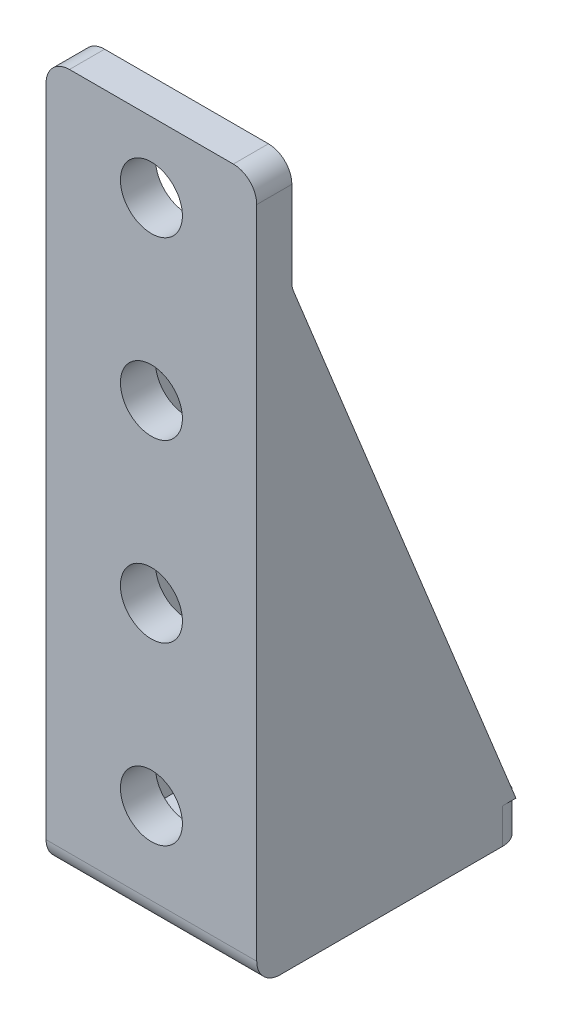
ISO-10303-21;
HEADER;
FILE_DESCRIPTION(('STEP AP214'),'2;1');
FILE_NAME('part.step','',(''),(''),'','','');
FILE_SCHEMA(('AUTOMOTIVE_DESIGN { 1 0 10303 214 1 1 1 1 }'));
ENDSEC;
DATA;
#1=APPLICATION_CONTEXT('core data for automotive mechanical design processes');
#2=APPLICATION_PROTOCOL_DEFINITION('international standard','automotive_design',2000,#1);
#3=PRODUCT_CONTEXT('',#1,'mechanical');
#4=PRODUCT('Part','Part','',(#3));
#5=PRODUCT_RELATED_PRODUCT_CATEGORY('part','',(#4));
#6=PRODUCT_DEFINITION_FORMATION('','',#4);
#7=PRODUCT_DEFINITION_CONTEXT('part definition',#1,'design');
#8=PRODUCT_DEFINITION('design','',#6,#7);
#9=PRODUCT_DEFINITION_SHAPE('','',#8);
#10=(LENGTH_UNIT() NAMED_UNIT(*) SI_UNIT(.MILLI.,.METRE.));
#11=(NAMED_UNIT(*) PLANE_ANGLE_UNIT() SI_UNIT($,.RADIAN.));
#12=(NAMED_UNIT(*) SI_UNIT($,.STERADIAN.) SOLID_ANGLE_UNIT());
#13=UNCERTAINTY_MEASURE_WITH_UNIT(LENGTH_MEASURE(1.E-05),#10,'distance_accuracy_value','');
#14=(GEOMETRIC_REPRESENTATION_CONTEXT(3) GLOBAL_UNCERTAINTY_ASSIGNED_CONTEXT((#13)) GLOBAL_UNIT_ASSIGNED_CONTEXT((#10,
#11,#12)) REPRESENTATION_CONTEXT('',''));
#15=CARTESIAN_POINT('',(0.,0.,0.));
#16=DIRECTION('',(0.,0.,1.));
#17=DIRECTION('',(1.,0.,0.));
#18=AXIS2_PLACEMENT_3D('',#15,#16,#17);
#19=CARTESIAN_POINT('',(0.,0.,0.));
#20=DIRECTION('',(0.,0.,1.));
#21=DIRECTION('',(1.,0.,0.));
#22=AXIS2_PLACEMENT_3D('',#19,#20,#21);
#23=PLANE('',#22);
#24=CARTESIAN_POINT('',(9.,-51.,0.));
#25=DIRECTION('',(0.,0.,1.));
#26=DIRECTION('',(1.,0.,0.));
#27=AXIS2_PLACEMENT_3D('',#24,#25,#26);
#28=CIRCLE('',#27,2.65);
#29=CARTESIAN_POINT('',(11.65,-51.,0.));
#30=VERTEX_POINT('',#29);
#31=EDGE_CURVE('E283',#30,#30,#28,.T.);
#32=ORIENTED_EDGE('',*,*,#31,.T.);
#33=EDGE_LOOP('',(#32));
#34=FACE_BOUND('',#33,.T.);
#35=CARTESIAN_POINT('',(9.,-36.,0.));
#36=DIRECTION('',(0.,0.,1.));
#37=DIRECTION('',(1.,0.,0.));
#38=AXIS2_PLACEMENT_3D('',#35,#36,#37);
#39=CIRCLE('',#38,2.65);
#40=CARTESIAN_POINT('',(11.65,-36.,0.));
#41=VERTEX_POINT('',#40);
#42=EDGE_CURVE('E291',#41,#41,#39,.T.);
#43=ORIENTED_EDGE('',*,*,#42,.T.);
#44=EDGE_LOOP('',(#43));
#45=FACE_BOUND('',#44,.T.);
#46=CARTESIAN_POINT('',(9.,-21.,0.));
#47=DIRECTION('',(0.,0.,1.));
#48=DIRECTION('',(1.,0.,0.));
#49=AXIS2_PLACEMENT_3D('',#46,#47,#48);
#50=CIRCLE('',#49,2.65);
#51=CARTESIAN_POINT('',(11.65,-21.,0.));
#52=VERTEX_POINT('',#51);
#53=EDGE_CURVE('E299',#52,#52,#50,.T.);
#54=ORIENTED_EDGE('',*,*,#53,.T.);
#55=EDGE_LOOP('',(#54));
#56=FACE_BOUND('',#55,.T.);
#57=CARTESIAN_POINT('',(9.,-6.,0.));
#58=DIRECTION('',(0.,0.,1.));
#59=DIRECTION('',(1.,0.,0.));
#60=AXIS2_PLACEMENT_3D('',#57,#58,#59);
#61=CIRCLE('',#60,2.65);
#62=CARTESIAN_POINT('',(11.65,-6.,0.));
#63=VERTEX_POINT('',#62);
#64=EDGE_CURVE('E304',#63,#63,#61,.T.);
#65=ORIENTED_EDGE('',*,*,#64,.T.);
#66=EDGE_LOOP('',(#65));
#67=FACE_BOUND('',#66,.T.);
#68=DIRECTION('',(0.,1.,0.));
#69=VECTOR('',#68,1.);
#70=CARTESIAN_POINT('',(3.,-9.62851294118363,0.));
#71=LINE('',#70,#69);
#72=CARTESIAN_POINT('',(3.00000000000001,-57.,0.));
#73=VERTEX_POINT('',#72);
#74=CARTESIAN_POINT('',(3.,-9.23962422751292,0.));
#75=VERTEX_POINT('',#74);
#76=EDGE_CURVE('E65',#73,#75,#71,.T.);
#77=ORIENTED_EDGE('',*,*,#76,.T.);
#78=DIRECTION('',(-1.,0.,0.));
#79=VECTOR('',#78,1.);
#80=CARTESIAN_POINT('',(0.,-9.23962422751292,0.));
#81=LINE('',#80,#79);
#82=CARTESIAN_POINT('',(0.,-9.23962422751292,0.));
#83=VERTEX_POINT('',#82);
#84=EDGE_CURVE('E395',#75,#83,#81,.T.);
#85=ORIENTED_EDGE('',*,*,#84,.T.);
#86=DIRECTION('',(0.,-1.,0.));
#87=VECTOR('',#86,1.);
#88=CARTESIAN_POINT('',(0.,0.,0.));
#89=LINE('',#88,#87);
#90=CARTESIAN_POINT('',(0.,-2.,0.));
#91=VERTEX_POINT('',#90);
#92=EDGE_CURVE('E309',#91,#83,#89,.T.);
#93=ORIENTED_EDGE('',*,*,#92,.F.);
#94=CARTESIAN_POINT('',(2.,-2.,0.));
#95=DIRECTION('',(0.,0.,1.));
#96=DIRECTION('',(1.,0.,0.));
#97=AXIS2_PLACEMENT_3D('',#94,#95,#96);
#98=CIRCLE('',#97,2.);
#99=CARTESIAN_POINT('',(2.,0.,0.));
#100=VERTEX_POINT('',#99);
#101=EDGE_CURVE('E359',#91,#100,#98,.F.);
#102=ORIENTED_EDGE('',*,*,#101,.T.);
#103=DIRECTION('',(-1.,0.,0.));
#104=VECTOR('',#103,1.);
#105=CARTESIAN_POINT('',(0.,0.,0.));
#106=LINE('',#105,#104);
#107=CARTESIAN_POINT('',(16.,0.,0.));
#108=VERTEX_POINT('',#107);
#109=EDGE_CURVE('E316',#108,#100,#106,.T.);
#110=ORIENTED_EDGE('',*,*,#109,.F.);
#111=CARTESIAN_POINT('',(16.,-2.,0.));
#112=DIRECTION('',(0.,0.,1.));
#113=DIRECTION('',(1.,0.,0.));
#114=AXIS2_PLACEMENT_3D('',#111,#112,#113);
#115=CIRCLE('',#114,2.);
#116=CARTESIAN_POINT('',(18.,-2.,0.));
#117=VERTEX_POINT('',#116);
#118=EDGE_CURVE('E354',#108,#117,#115,.F.);
#119=ORIENTED_EDGE('',*,*,#118,.T.);
#120=DIRECTION('',(0.,1.,0.));
#121=VECTOR('',#120,1.);
#122=CARTESIAN_POINT('',(18.,0.,0.));
#123=LINE('',#122,#121);
#124=CARTESIAN_POINT('',(18.,-9.23962422751292,0.));
#125=VERTEX_POINT('',#124);
#126=EDGE_CURVE('E321',#125,#117,#123,.T.);
#127=ORIENTED_EDGE('',*,*,#126,.F.);
#128=DIRECTION('',(1.,0.,0.));
#129=VECTOR('',#128,1.);
#130=CARTESIAN_POINT('',(0.,-9.23962422751292,0.));
#131=LINE('',#130,#129);
#132=CARTESIAN_POINT('',(15.,-9.23962422751292,0.));
#133=VERTEX_POINT('',#132);
#134=EDGE_CURVE('E388',#125,#133,#131,.F.);
#135=ORIENTED_EDGE('',*,*,#134,.T.);
#136=DIRECTION('',(0.,-1.,0.));
#137=VECTOR('',#136,1.);
#138=CARTESIAN_POINT('',(15.,-57.,0.));
#139=LINE('',#138,#137);
#140=CARTESIAN_POINT('',(15.,-57.,0.));
#141=VERTEX_POINT('',#140);
#142=EDGE_CURVE('E221',#133,#141,#139,.T.);
#143=ORIENTED_EDGE('',*,*,#142,.T.);
#144=DIRECTION('',(-1.,0.,0.));
#145=VECTOR('',#144,1.);
#146=CARTESIAN_POINT('',(0.,-57.,0.));
#147=LINE('',#146,#145);
#148=EDGE_CURVE('E282',#141,#73,#147,.T.);
#149=ORIENTED_EDGE('',*,*,#148,.T.);
#150=EDGE_LOOP('',(#77,#85,#93,#102,#110,#119,#127,#135,#143,#149));
#151=FACE_BOUND('',#150,.T.);
#152=ADVANCED_FACE('F39',(#34,#45,#56,#67,#151),#23,.F.);
#153=CARTESIAN_POINT('',(0.,-57.,0.));
#154=DIRECTION('',(0.,-1.,0.));
#155=DIRECTION('',(0.,0.,-1.));
#156=AXIS2_PLACEMENT_3D('',#153,#154,#155);
#157=PLANE('',#156);
#158=DIRECTION('',(0.,0.,1.));
#159=VECTOR('',#158,1.);
#160=CARTESIAN_POINT('',(10.6,-57.,-6.02510414656997));
#161=LINE('',#160,#159);
#162=CARTESIAN_POINT('',(10.6,-57.,-16.02510414657));
#163=VERTEX_POINT('',#162);
#164=CARTESIAN_POINT('',(10.6,-57.,-6.02510414656997));
#165=VERTEX_POINT('',#164);
#166=EDGE_CURVE('E258',#163,#165,#161,.T.);
#167=ORIENTED_EDGE('',*,*,#166,.T.);
#168=CARTESIAN_POINT('',(8.99999999999999,-57.,-6.02510414656997));
#169=DIRECTION('',(0.,-1.,0.));
#170=DIRECTION('',(0.,0.,-1.));
#171=AXIS2_PLACEMENT_3D('',#168,#169,#170);
#172=CIRCLE('',#171,1.6);
#173=CARTESIAN_POINT('',(7.39999999999999,-57.,-6.02510414656997));
#174=VERTEX_POINT('',#173);
#175=EDGE_CURVE('E247',#165,#174,#172,.T.);
#176=ORIENTED_EDGE('',*,*,#175,.T.);
#177=DIRECTION('',(0.,0.,-1.));
#178=VECTOR('',#177,1.);
#179=CARTESIAN_POINT('',(7.39999999999999,-57.,-6.02510414656997));
#180=LINE('',#179,#178);
#181=CARTESIAN_POINT('',(7.39999999999999,-57.,-16.02510414657));
#182=VERTEX_POINT('',#181);
#183=EDGE_CURVE('E246',#174,#182,#180,.T.);
#184=ORIENTED_EDGE('',*,*,#183,.T.);
#185=CARTESIAN_POINT('',(8.99999999999998,-57.,-16.02510414657));
#186=DIRECTION('',(0.,-1.,0.));
#187=DIRECTION('',(0.,0.,-1.));
#188=AXIS2_PLACEMENT_3D('',#185,#186,#187);
#189=CIRCLE('',#188,1.6);
#190=EDGE_CURVE('E254',#182,#163,#189,.T.);
#191=ORIENTED_EDGE('',*,*,#190,.T.);
#192=EDGE_LOOP('',(#167,#176,#184,#191));
#193=FACE_BOUND('',#192,.T.);
#194=DIRECTION('',(0.,0.,-1.));
#195=VECTOR('',#194,1.);
#196=CARTESIAN_POINT('',(15.,-57.,-19.146125));
#197=LINE('',#196,#195);
#198=CARTESIAN_POINT('',(15.,-57.,-20.));
#199=VERTEX_POINT('',#198);
#200=EDGE_CURVE('E230',#141,#199,#197,.T.);
#201=ORIENTED_EDGE('',*,*,#200,.T.);
#202=DIRECTION('',(1.,0.,0.));
#203=VECTOR('',#202,1.);
#204=CARTESIAN_POINT('',(0.,-57.,-20.));
#205=LINE('',#204,#203);
#206=CARTESIAN_POINT('',(3.,-57.,-20.));
#207=VERTEX_POINT('',#206);
#208=EDGE_CURVE('E285',#207,#199,#205,.T.);
#209=ORIENTED_EDGE('',*,*,#208,.F.);
#210=DIRECTION('',(0.,0.,1.));
#211=VECTOR('',#210,1.);
#212=CARTESIAN_POINT('',(3.00000000000001,-57.,0.));
#213=LINE('',#212,#211);
#214=EDGE_CURVE('E236',#207,#73,#213,.T.);
#215=ORIENTED_EDGE('',*,*,#214,.T.);
#216=ORIENTED_EDGE('',*,*,#148,.F.);
#217=EDGE_LOOP('',(#201,#209,#215,#216));
#218=FACE_BOUND('',#217,.T.);
#219=ADVANCED_FACE('F443',(#193,#218),#157,.F.);
#220=CARTESIAN_POINT('',(0.,0.,3.));
#221=DIRECTION('',(0.,0.,1.));
#222=DIRECTION('',(1.,0.,0.));
#223=AXIS2_PLACEMENT_3D('',#220,#221,#222);
#224=PLANE('',#223);
#225=CARTESIAN_POINT('',(9.,-36.,3.));
#226=DIRECTION('',(0.,0.,1.));
#227=DIRECTION('',(1.,0.,0.));
#228=AXIS2_PLACEMENT_3D('',#225,#226,#227);
#229=CIRCLE('',#228,2.65);
#230=CARTESIAN_POINT('',(11.65,-36.,3.));
#231=VERTEX_POINT('',#230);
#232=EDGE_CURVE('E293',#231,#231,#229,.T.);
#233=ORIENTED_EDGE('',*,*,#232,.F.);
#234=EDGE_LOOP('',(#233));
#235=FACE_BOUND('',#234,.T.);
#236=CARTESIAN_POINT('',(9.,-6.,3.));
#237=DIRECTION('',(0.,0.,1.));
#238=DIRECTION('',(1.,0.,0.));
#239=AXIS2_PLACEMENT_3D('',#236,#237,#238);
#240=CIRCLE('',#239,2.65);
#241=CARTESIAN_POINT('',(11.65,-6.,3.));
#242=VERTEX_POINT('',#241);
#243=EDGE_CURVE('E307',#242,#242,#240,.T.);
#244=ORIENTED_EDGE('',*,*,#243,.F.);
#245=EDGE_LOOP('',(#244));
#246=FACE_BOUND('',#245,.T.);
#247=DIRECTION('',(0.,-1.,0.));
#248=VECTOR('',#247,1.);
#249=CARTESIAN_POINT('',(0.,0.,3.));
#250=LINE('',#249,#248);
#251=CARTESIAN_POINT('',(0.,-2.,3.));
#252=VERTEX_POINT('',#251);
#253=CARTESIAN_POINT('',(0.,-58.,3.));
#254=VERTEX_POINT('',#253);
#255=EDGE_CURVE('E315',#252,#254,#250,.T.);
#256=ORIENTED_EDGE('',*,*,#255,.T.);
#257=DIRECTION('',(1.,0.,0.));
#258=VECTOR('',#257,1.);
#259=CARTESIAN_POINT('',(18.,-58.,3.));
#260=LINE('',#259,#258);
#261=CARTESIAN_POINT('',(18.,-58.,3.));
#262=VERTEX_POINT('',#261);
#263=EDGE_CURVE('E368',#254,#262,#260,.T.);
#264=ORIENTED_EDGE('',*,*,#263,.T.);
#265=DIRECTION('',(0.,1.,0.));
#266=VECTOR('',#265,1.);
#267=CARTESIAN_POINT('',(18.,0.,3.));
#268=LINE('',#267,#266);
#269=CARTESIAN_POINT('',(18.,-2.,3.));
#270=VERTEX_POINT('',#269);
#271=EDGE_CURVE('E314',#262,#270,#268,.T.);
#272=ORIENTED_EDGE('',*,*,#271,.T.);
#273=CARTESIAN_POINT('',(16.,-2.,3.));
#274=DIRECTION('',(0.,0.,1.));
#275=DIRECTION('',(1.,0.,0.));
#276=AXIS2_PLACEMENT_3D('',#273,#274,#275);
#277=CIRCLE('',#276,2.);
#278=CARTESIAN_POINT('',(16.,0.,3.));
#279=VERTEX_POINT('',#278);
#280=EDGE_CURVE('E364',#270,#279,#277,.T.);
#281=ORIENTED_EDGE('',*,*,#280,.T.);
#282=DIRECTION('',(-1.,0.,0.));
#283=VECTOR('',#282,1.);
#284=CARTESIAN_POINT('',(0.,0.,3.));
#285=LINE('',#284,#283);
#286=CARTESIAN_POINT('',(2.,0.,3.));
#287=VERTEX_POINT('',#286);
#288=EDGE_CURVE('E317',#279,#287,#285,.T.);
#289=ORIENTED_EDGE('',*,*,#288,.T.);
#290=CARTESIAN_POINT('',(2.,-2.,3.));
#291=DIRECTION('',(0.,0.,1.));
#292=DIRECTION('',(1.,0.,0.));
#293=AXIS2_PLACEMENT_3D('',#290,#291,#292);
#294=CIRCLE('',#293,2.);
#295=EDGE_CURVE('E370',#287,#252,#294,.T.);
#296=ORIENTED_EDGE('',*,*,#295,.T.);
#297=EDGE_LOOP('',(#256,#264,#272,#281,#289,#296));
#298=FACE_BOUND('',#297,.T.);
#299=CARTESIAN_POINT('',(9.,-21.,3.));
#300=DIRECTION('',(0.,0.,1.));
#301=DIRECTION('',(1.,0.,0.));
#302=AXIS2_PLACEMENT_3D('',#299,#300,#301);
#303=CIRCLE('',#302,2.65);
#304=CARTESIAN_POINT('',(11.65,-21.,3.));
#305=VERTEX_POINT('',#304);
#306=EDGE_CURVE('E298',#305,#305,#303,.T.);
#307=ORIENTED_EDGE('',*,*,#306,.F.);
#308=EDGE_LOOP('',(#307));
#309=FACE_BOUND('',#308,.T.);
#310=CARTESIAN_POINT('',(9.,-51.,3.));
#311=DIRECTION('',(0.,0.,1.));
#312=DIRECTION('',(1.,0.,0.));
#313=AXIS2_PLACEMENT_3D('',#310,#311,#312);
#314=CIRCLE('',#313,2.65);
#315=CARTESIAN_POINT('',(11.65,-51.,3.));
#316=VERTEX_POINT('',#315);
#317=EDGE_CURVE('E287',#316,#316,#314,.T.);
#318=ORIENTED_EDGE('',*,*,#317,.F.);
#319=EDGE_LOOP('',(#318));
#320=FACE_BOUND('',#319,.T.);
#321=ADVANCED_FACE('F452',(#235,#246,#298,#309,#320),#224,.T.);
#322=CARTESIAN_POINT('',(0.,0.,3.));
#323=DIRECTION('',(1.,0.,0.));
#324=DIRECTION('',(0.,1.,0.));
#325=AXIS2_PLACEMENT_3D('',#322,#323,#324);
#326=PLANE('',#325);
#327=DIRECTION('',(0.,0.,-1.));
#328=VECTOR('',#327,1.);
#329=CARTESIAN_POINT('',(0.,-60.,3.));
#330=LINE('',#329,#328);
#331=CARTESIAN_POINT('',(0.,-60.,1.));
#332=VERTEX_POINT('',#331);
#333=CARTESIAN_POINT('',(0.,-60.,-18.));
#334=VERTEX_POINT('',#333);
#335=EDGE_CURVE('E326',#332,#334,#330,.T.);
#336=ORIENTED_EDGE('',*,*,#335,.F.);
#337=CARTESIAN_POINT('',(0.,-58.,1.));
#338=DIRECTION('',(1.,0.,0.));
#339=DIRECTION('',(0.,1.,0.));
#340=AXIS2_PLACEMENT_3D('',#337,#338,#339);
#341=CIRCLE('',#340,2.);
#342=EDGE_CURVE('E377',#332,#254,#341,.F.);
#343=ORIENTED_EDGE('',*,*,#342,.T.);
#344=ORIENTED_EDGE('',*,*,#255,.F.);
#345=DIRECTION('',(0.,0.,-1.));
#346=VECTOR('',#345,1.);
#347=CARTESIAN_POINT('',(0.,-2.,3.));
#348=LINE('',#347,#346);
#349=EDGE_CURVE('E347',#252,#91,#348,.T.);
#350=ORIENTED_EDGE('',*,*,#349,.T.);
#351=ORIENTED_EDGE('',*,*,#92,.T.);
#352=CARTESIAN_POINT('',(0.,-9.23962422751292,-2.));
#353=DIRECTION('',(1.,0.,0.));
#354=DIRECTION('',(0.,1.,0.));
#355=AXIS2_PLACEMENT_3D('',#352,#353,#354);
#356=CIRCLE('',#355,2.);
#357=CARTESIAN_POINT('',(0.,-9.98906629362899,-0.145724780531306));
#358=VERTEX_POINT('',#357);
#359=EDGE_CURVE('E563',#83,#358,#356,.T.);
#360=ORIENTED_EDGE('',*,*,#359,.T.);
#361=DIRECTION('',(0.,-0.927137609734347,-0.374721033058036));
#362=VECTOR('',#361,1.);
#363=CARTESIAN_POINT('',(0.,-9.62851294118363,0.));
#364=LINE('',#363,#362);
#365=CARTESIAN_POINT('',(0.,-57.,-19.146125));
#366=VERTEX_POINT('',#365);
#367=EDGE_CURVE('E209',#358,#366,#364,.T.);
#368=ORIENTED_EDGE('',*,*,#367,.T.);
#369=DIRECTION('',(0.,0.,1.));
#370=VECTOR('',#369,1.);
#371=CARTESIAN_POINT('',(0.,-57.,0.));
#372=LINE('',#371,#370);
#373=CARTESIAN_POINT('',(0.,-57.,-18.));
#374=VERTEX_POINT('',#373);
#375=EDGE_CURVE('E231',#366,#374,#372,.T.);
#376=ORIENTED_EDGE('',*,*,#375,.T.);
#377=DIRECTION('',(0.,-1.,0.));
#378=VECTOR('',#377,1.);
#379=CARTESIAN_POINT('',(0.,-60.,-18.));
#380=LINE('',#379,#378);
#381=EDGE_CURVE('E355',#374,#334,#380,.T.);
#382=ORIENTED_EDGE('',*,*,#381,.T.);
#383=EDGE_LOOP('',(#336,#343,#344,#350,#351,#360,#368,#376,#382));
#384=FACE_BOUND('',#383,.T.);
#385=ADVANCED_FACE('F412',(#384),#326,.F.);
#386=CARTESIAN_POINT('',(0.,-60.,3.));
#387=DIRECTION('',(0.,1.,0.));
#388=DIRECTION('',(0.,0.,1.));
#389=AXIS2_PLACEMENT_3D('',#386,#387,#388);
#390=PLANE('',#389);
#391=DIRECTION('',(0.,0.,-1.));
#392=VECTOR('',#391,1.);
#393=CARTESIAN_POINT('',(18.,-60.,3.));
#394=LINE('',#393,#392);
#395=CARTESIAN_POINT('',(18.,-60.,1.));
#396=VERTEX_POINT('',#395);
#397=CARTESIAN_POINT('',(18.,-60.,-18.));
#398=VERTEX_POINT('',#397);
#399=EDGE_CURVE('E322',#396,#398,#394,.T.);
#400=ORIENTED_EDGE('',*,*,#399,.F.);
#401=DIRECTION('',(1.,0.,0.));
#402=VECTOR('',#401,1.);
#403=CARTESIAN_POINT('',(0.,-60.,1.));
#404=LINE('',#403,#402);
#405=EDGE_CURVE('E371',#396,#332,#404,.F.);
#406=ORIENTED_EDGE('',*,*,#405,.T.);
#407=ORIENTED_EDGE('',*,*,#335,.T.);
#408=CARTESIAN_POINT('',(2.00000000000001,-60.,-18.));
#409=DIRECTION('',(0.,1.,0.));
#410=DIRECTION('',(0.,0.,1.));
#411=AXIS2_PLACEMENT_3D('',#408,#409,#410);
#412=CIRCLE('',#411,2.);
#413=CARTESIAN_POINT('',(2.00000000000001,-60.,-20.));
#414=VERTEX_POINT('',#413);
#415=EDGE_CURVE('E340',#334,#414,#412,.F.);
#416=ORIENTED_EDGE('',*,*,#415,.T.);
#417=DIRECTION('',(1.,0.,0.));
#418=VECTOR('',#417,1.);
#419=CARTESIAN_POINT('',(0.,-60.,-20.));
#420=LINE('',#419,#418);
#421=CARTESIAN_POINT('',(16.,-60.,-20.));
#422=VERTEX_POINT('',#421);
#423=EDGE_CURVE('E271',#414,#422,#420,.T.);
#424=ORIENTED_EDGE('',*,*,#423,.T.);
#425=CARTESIAN_POINT('',(16.,-60.,-18.));
#426=DIRECTION('',(0.,1.,0.));
#427=DIRECTION('',(0.,0.,1.));
#428=AXIS2_PLACEMENT_3D('',#425,#426,#427);
#429=CIRCLE('',#428,2.);
#430=EDGE_CURVE('E339',#422,#398,#429,.F.);
#431=ORIENTED_EDGE('',*,*,#430,.T.);
#432=EDGE_LOOP('',(#400,#406,#407,#416,#424,#431));
#433=FACE_BOUND('',#432,.T.);
#434=CARTESIAN_POINT('',(8.99999999999999,-60.,-6.02510414656997));
#435=DIRECTION('',(0.,-1.,0.));
#436=DIRECTION('',(0.,0.,-1.));
#437=AXIS2_PLACEMENT_3D('',#434,#435,#436);
#438=CIRCLE('',#437,1.6);
#439=CARTESIAN_POINT('',(10.6,-60.,-6.02510414656997));
#440=VERTEX_POINT('',#439);
#441=CARTESIAN_POINT('',(7.39999999999999,-60.,-6.02510414656997));
#442=VERTEX_POINT('',#441);
#443=EDGE_CURVE('E244',#440,#442,#438,.T.);
#444=ORIENTED_EDGE('',*,*,#443,.F.);
#445=DIRECTION('',(0.,0.,1.));
#446=VECTOR('',#445,1.);
#447=CARTESIAN_POINT('',(10.6,-60.,-6.02510414656997));
#448=LINE('',#447,#446);
#449=CARTESIAN_POINT('',(10.6,-60.,-16.02510414657));
#450=VERTEX_POINT('',#449);
#451=EDGE_CURVE('E248',#450,#440,#448,.T.);
#452=ORIENTED_EDGE('',*,*,#451,.F.);
#453=CARTESIAN_POINT('',(8.99999999999998,-60.,-16.02510414657));
#454=DIRECTION('',(0.,-1.,0.));
#455=DIRECTION('',(0.,0.,-1.));
#456=AXIS2_PLACEMENT_3D('',#453,#454,#455);
#457=CIRCLE('',#456,1.6);
#458=CARTESIAN_POINT('',(7.39999999999998,-60.,-16.02510414657));
#459=VERTEX_POINT('',#458);
#460=EDGE_CURVE('E264',#459,#450,#457,.T.);
#461=ORIENTED_EDGE('',*,*,#460,.F.);
#462=DIRECTION('',(0.,0.,-1.));
#463=VECTOR('',#462,1.);
#464=CARTESIAN_POINT('',(7.39999999999999,-60.,-6.02510414656997));
#465=LINE('',#464,#463);
#466=EDGE_CURVE('E263',#442,#459,#465,.T.);
#467=ORIENTED_EDGE('',*,*,#466,.F.);
#468=EDGE_LOOP('',(#444,#452,#461,#467));
#469=FACE_BOUND('',#468,.T.);
#470=ADVANCED_FACE('F463',(#433,#469),#390,.F.);
#471=CARTESIAN_POINT('',(18.,0.,3.));
#472=DIRECTION('',(-1.,0.,0.));
#473=DIRECTION('',(0.,-1.,0.));
#474=AXIS2_PLACEMENT_3D('',#471,#472,#473);
#475=PLANE('',#474);
#476=ORIENTED_EDGE('',*,*,#271,.F.);
#477=CARTESIAN_POINT('',(18.,-58.,1.));
#478=DIRECTION('',(-1.,0.,0.));
#479=DIRECTION('',(0.,-1.,0.));
#480=AXIS2_PLACEMENT_3D('',#477,#478,#479);
#481=CIRCLE('',#480,2.);
#482=EDGE_CURVE('E374',#262,#396,#481,.F.);
#483=ORIENTED_EDGE('',*,*,#482,.T.);
#484=ORIENTED_EDGE('',*,*,#399,.T.);
#485=DIRECTION('',(0.,-1.,0.));
#486=VECTOR('',#485,1.);
#487=CARTESIAN_POINT('',(18.,-57.,-18.));
#488=LINE('',#487,#486);
#489=CARTESIAN_POINT('',(18.,-57.,-18.));
#490=VERTEX_POINT('',#489);
#491=EDGE_CURVE('E220',#398,#490,#488,.F.);
#492=ORIENTED_EDGE('',*,*,#491,.T.);
#493=DIRECTION('',(0.,0.,-1.));
#494=VECTOR('',#493,1.);
#495=CARTESIAN_POINT('',(18.,-57.,-19.146125));
#496=LINE('',#495,#494);
#497=CARTESIAN_POINT('',(18.,-57.,-19.146125));
#498=VERTEX_POINT('',#497);
#499=EDGE_CURVE('E202',#490,#498,#496,.T.);
#500=ORIENTED_EDGE('',*,*,#499,.T.);
#501=DIRECTION('',(0.,0.927137609734347,0.374721033058036));
#502=VECTOR('',#501,1.);
#503=CARTESIAN_POINT('',(18.,-9.62851294118363,0.));
#504=LINE('',#503,#502);
#505=CARTESIAN_POINT('',(18.,-9.98906629362899,-0.145724780531306));
#506=VERTEX_POINT('',#505);
#507=EDGE_CURVE('E214',#498,#506,#504,.T.);
#508=ORIENTED_EDGE('',*,*,#507,.T.);
#509=CARTESIAN_POINT('',(18.,-9.23962422751292,-2.));
#510=DIRECTION('',(-1.,0.,0.));
#511=DIRECTION('',(0.,-1.,0.));
#512=AXIS2_PLACEMENT_3D('',#509,#510,#511);
#513=CIRCLE('',#512,2.);
#514=EDGE_CURVE('E50',#506,#125,#513,.T.);
#515=ORIENTED_EDGE('',*,*,#514,.T.);
#516=ORIENTED_EDGE('',*,*,#126,.T.);
#517=DIRECTION('',(0.,0.,-1.));
#518=VECTOR('',#517,1.);
#519=CARTESIAN_POINT('',(18.,-2.,3.));
#520=LINE('',#519,#518);
#521=EDGE_CURVE('E345',#117,#270,#520,.F.);
#522=ORIENTED_EDGE('',*,*,#521,.T.);
#523=EDGE_LOOP('',(#476,#483,#484,#492,#500,#508,#515,#516,#522));
#524=FACE_BOUND('',#523,.T.);
#525=ADVANCED_FACE('F213',(#524),#475,.F.);
#526=CARTESIAN_POINT('',(0.,0.,3.));
#527=DIRECTION('',(0.,-1.,0.));
#528=DIRECTION('',(0.,0.,-1.));
#529=AXIS2_PLACEMENT_3D('',#526,#527,#528);
#530=PLANE('',#529);
#531=ORIENTED_EDGE('',*,*,#109,.T.);
#532=DIRECTION('',(0.,0.,-1.));
#533=VECTOR('',#532,1.);
#534=CARTESIAN_POINT('',(2.,0.,3.));
#535=LINE('',#534,#533);
#536=EDGE_CURVE('E362',#100,#287,#535,.F.);
#537=ORIENTED_EDGE('',*,*,#536,.T.);
#538=ORIENTED_EDGE('',*,*,#288,.F.);
#539=DIRECTION('',(0.,0.,-1.));
#540=VECTOR('',#539,1.);
#541=CARTESIAN_POINT('',(16.,0.,3.));
#542=LINE('',#541,#540);
#543=EDGE_CURVE('E358',#279,#108,#542,.T.);
#544=ORIENTED_EDGE('',*,*,#543,.T.);
#545=EDGE_LOOP('',(#531,#537,#538,#544));
#546=FACE_BOUND('',#545,.T.);
#547=ADVANCED_FACE('F456',(#546),#530,.F.);
#548=CARTESIAN_POINT('',(9.,-6.,3.));
#549=DIRECTION('',(0.,0.,-1.));
#550=DIRECTION('',(-1.,0.,0.));
#551=AXIS2_PLACEMENT_3D('',#548,#549,#550);
#552=CYLINDRICAL_SURFACE('',#551,2.65);
#553=ORIENTED_EDGE('',*,*,#243,.T.);
#554=EDGE_LOOP('',(#553));
#555=FACE_BOUND('',#554,.T.);
#556=ORIENTED_EDGE('',*,*,#64,.F.);
#557=EDGE_LOOP('',(#556));
#558=FACE_BOUND('',#557,.T.);
#559=ADVANCED_FACE('F461',(#555,#558),#552,.F.);
#560=CARTESIAN_POINT('',(9.,-21.,3.));
#561=DIRECTION('',(0.,0.,-1.));
#562=DIRECTION('',(-1.,0.,0.));
#563=AXIS2_PLACEMENT_3D('',#560,#561,#562);
#564=CYLINDRICAL_SURFACE('',#563,2.65);
#565=ORIENTED_EDGE('',*,*,#306,.T.);
#566=EDGE_LOOP('',(#565));
#567=FACE_BOUND('',#566,.T.);
#568=ORIENTED_EDGE('',*,*,#53,.F.);
#569=EDGE_LOOP('',(#568));
#570=FACE_BOUND('',#569,.T.);
#571=ADVANCED_FACE('F512',(#567,#570),#564,.F.);
#572=CARTESIAN_POINT('',(9.,-36.,3.));
#573=DIRECTION('',(0.,0.,-1.));
#574=DIRECTION('',(-1.,0.,0.));
#575=AXIS2_PLACEMENT_3D('',#572,#573,#574);
#576=CYLINDRICAL_SURFACE('',#575,2.65);
#577=ORIENTED_EDGE('',*,*,#232,.T.);
#578=EDGE_LOOP('',(#577));
#579=FACE_BOUND('',#578,.T.);
#580=ORIENTED_EDGE('',*,*,#42,.F.);
#581=EDGE_LOOP('',(#580));
#582=FACE_BOUND('',#581,.T.);
#583=ADVANCED_FACE('F506',(#579,#582),#576,.F.);
#584=CARTESIAN_POINT('',(9.,-51.,3.));
#585=DIRECTION('',(0.,0.,-1.));
#586=DIRECTION('',(-1.,0.,0.));
#587=AXIS2_PLACEMENT_3D('',#584,#585,#586);
#588=CYLINDRICAL_SURFACE('',#587,2.65);
#589=ORIENTED_EDGE('',*,*,#317,.T.);
#590=EDGE_LOOP('',(#589));
#591=FACE_BOUND('',#590,.T.);
#592=ORIENTED_EDGE('',*,*,#31,.F.);
#593=EDGE_LOOP('',(#592));
#594=FACE_BOUND('',#593,.T.);
#595=ADVANCED_FACE('F504',(#591,#594),#588,.F.);
#596=CARTESIAN_POINT('',(0.,-57.,-20.));
#597=DIRECTION('',(0.,0.,-1.));
#598=DIRECTION('',(-1.,0.,0.));
#599=AXIS2_PLACEMENT_3D('',#596,#597,#598);
#600=PLANE('',#599);
#601=CARTESIAN_POINT('',(2.00000000000001,-57.,-20.));
#602=VERTEX_POINT('',#601);
#603=EDGE_CURVE('E277',#602,#207,#205,.T.);
#604=ORIENTED_EDGE('',*,*,#603,.T.);
#605=ORIENTED_EDGE('',*,*,#208,.T.);
#606=CARTESIAN_POINT('',(16.,-57.,-20.));
#607=VERTEX_POINT('',#606);
#608=EDGE_CURVE('E284',#199,#607,#205,.T.);
#609=ORIENTED_EDGE('',*,*,#608,.T.);
#610=DIRECTION('',(0.,-1.,0.));
#611=VECTOR('',#610,1.);
#612=CARTESIAN_POINT('',(16.,-60.,-20.));
#613=LINE('',#612,#611);
#614=EDGE_CURVE('E335',#607,#422,#613,.T.);
#615=ORIENTED_EDGE('',*,*,#614,.T.);
#616=ORIENTED_EDGE('',*,*,#423,.F.);
#617=DIRECTION('',(0.,-1.,0.));
#618=VECTOR('',#617,1.);
#619=CARTESIAN_POINT('',(2.00000000000001,-57.,-20.));
#620=LINE('',#619,#618);
#621=EDGE_CURVE('E333',#414,#602,#620,.F.);
#622=ORIENTED_EDGE('',*,*,#621,.T.);
#623=EDGE_LOOP('',(#604,#605,#609,#615,#616,#622));
#624=FACE_BOUND('',#623,.T.);
#625=ADVANCED_FACE('F501',(#624),#600,.T.);
#626=CARTESIAN_POINT('',(8.99999999999999,-57.,-6.02510414656997));
#627=DIRECTION('',(0.,-1.,0.));
#628=DIRECTION('',(0.,0.,-1.));
#629=AXIS2_PLACEMENT_3D('',#626,#627,#628);
#630=CYLINDRICAL_SURFACE('',#629,1.6);
#631=ORIENTED_EDGE('',*,*,#443,.T.);
#632=DIRECTION('',(0.,-1.,0.));
#633=VECTOR('',#632,1.);
#634=CARTESIAN_POINT('',(7.39999999999999,-57.,-6.02510414656997));
#635=LINE('',#634,#633);
#636=EDGE_CURVE('E260',#174,#442,#635,.T.);
#637=ORIENTED_EDGE('',*,*,#636,.F.);
#638=ORIENTED_EDGE('',*,*,#175,.F.);
#639=DIRECTION('',(0.,-1.,0.));
#640=VECTOR('',#639,1.);
#641=CARTESIAN_POINT('',(10.6,-57.,-6.02510414656997));
#642=LINE('',#641,#640);
#643=EDGE_CURVE('E267',#165,#440,#642,.T.);
#644=ORIENTED_EDGE('',*,*,#643,.T.);
#645=EDGE_LOOP('',(#631,#637,#638,#644));
#646=FACE_BOUND('',#645,.T.);
#647=ADVANCED_FACE('F476',(#646),#630,.F.);
#648=CARTESIAN_POINT('',(10.6,-57.,-6.02510414656997));
#649=DIRECTION('',(1.,0.,0.));
#650=DIRECTION('',(0.,0.,-1.));
#651=AXIS2_PLACEMENT_3D('',#648,#649,#650);
#652=PLANE('',#651);
#653=ORIENTED_EDGE('',*,*,#451,.T.);
#654=ORIENTED_EDGE('',*,*,#643,.F.);
#655=ORIENTED_EDGE('',*,*,#166,.F.);
#656=DIRECTION('',(0.,-1.,0.));
#657=VECTOR('',#656,1.);
#658=CARTESIAN_POINT('',(10.6,-57.,-16.02510414657));
#659=LINE('',#658,#657);
#660=EDGE_CURVE('E275',#163,#450,#659,.T.);
#661=ORIENTED_EDGE('',*,*,#660,.T.);
#662=EDGE_LOOP('',(#653,#654,#655,#661));
#663=FACE_BOUND('',#662,.T.);
#664=ADVANCED_FACE('F490',(#663),#652,.F.);
#665=CARTESIAN_POINT('',(8.99999999999998,-57.,-16.02510414657));
#666=DIRECTION('',(0.,-1.,0.));
#667=DIRECTION('',(0.,0.,-1.));
#668=AXIS2_PLACEMENT_3D('',#665,#666,#667);
#669=CYLINDRICAL_SURFACE('',#668,1.6);
#670=ORIENTED_EDGE('',*,*,#460,.T.);
#671=ORIENTED_EDGE('',*,*,#660,.F.);
#672=ORIENTED_EDGE('',*,*,#190,.F.);
#673=DIRECTION('',(0.,-1.,0.));
#674=VECTOR('',#673,1.);
#675=CARTESIAN_POINT('',(7.39999999999998,-57.,-16.02510414657));
#676=LINE('',#675,#674);
#677=EDGE_CURVE('E272',#182,#459,#676,.T.);
#678=ORIENTED_EDGE('',*,*,#677,.T.);
#679=EDGE_LOOP('',(#670,#671,#672,#678));
#680=FACE_BOUND('',#679,.T.);
#681=ADVANCED_FACE('F489',(#680),#669,.F.);
#682=CARTESIAN_POINT('',(7.39999999999999,-57.,-6.02510414656997));
#683=DIRECTION('',(-1.,0.,0.));
#684=DIRECTION('',(0.,0.,1.));
#685=AXIS2_PLACEMENT_3D('',#682,#683,#684);
#686=PLANE('',#685);
#687=ORIENTED_EDGE('',*,*,#466,.T.);
#688=ORIENTED_EDGE('',*,*,#677,.F.);
#689=ORIENTED_EDGE('',*,*,#183,.F.);
#690=ORIENTED_EDGE('',*,*,#636,.T.);
#691=EDGE_LOOP('',(#687,#688,#689,#690));
#692=FACE_BOUND('',#691,.T.);
#693=ADVANCED_FACE('F414',(#692),#686,.F.);
#694=CARTESIAN_POINT('',(16.,-57.,-18.));
#695=DIRECTION('',(0.,1.,0.));
#696=DIRECTION('',(-1.,0.,0.));
#697=AXIS2_PLACEMENT_3D('',#694,#695,#696);
#698=CYLINDRICAL_SURFACE('',#697,2.);
#699=CARTESIAN_POINT('',(16.,-57.,-18.));
#700=DIRECTION('',(0.,-1.,0.));
#701=DIRECTION('',(0.,0.,-1.));
#702=AXIS2_PLACEMENT_3D('',#699,#700,#701);
#703=CIRCLE('',#702,2.);
#704=CARTESIAN_POINT('',(17.6390233324682,-57.,-19.146125));
#705=VERTEX_POINT('',#704);
#706=EDGE_CURVE('E204',#490,#705,#703,.F.);
#707=ORIENTED_EDGE('',*,*,#706,.F.);
#708=ORIENTED_EDGE('',*,*,#491,.F.);
#709=ORIENTED_EDGE('',*,*,#430,.F.);
#710=ORIENTED_EDGE('',*,*,#614,.F.);
#711=CARTESIAN_POINT('',(16.,-57.,-20.));
#712=CARTESIAN_POINT('',(16.0525901834791,-56.9999863679398,-20.0000055075154));
#713=CARTESIAN_POINT('',(16.1051794967486,-56.9994374847329,-19.9979256785175));
#714=CARTESIAN_POINT('',(16.210013550274,-56.9971705892891,-19.9896366522378));
#715=CARTESIAN_POINT('',(16.2622582410829,-56.9954524128124,-19.9834268748628));
#716=CARTESIAN_POINT('',(16.36619567388,-56.9907414342816,-19.9668953521353));
#717=CARTESIAN_POINT('',(16.4178863768399,-56.9877449517443,-19.956561739073));
#718=CARTESIAN_POINT('',(16.5201767633196,-56.9802827092269,-19.9318875076853));
#719=CARTESIAN_POINT('',(16.5707764972964,-56.975817017353,-19.9175470751037));
#720=CARTESIAN_POINT('',(16.720579167592,-56.9598243373002,-19.8686295216572));
#721=CARTESIAN_POINT('',(16.8176855891355,-56.9457053092431,-19.8281722194754));
#722=CARTESIAN_POINT('',(17.0027775168641,-56.9078780478126,-19.7335568715188));
#723=CARTESIAN_POINT('',(17.0907769343733,-56.8841847194961,-19.6794201703879));
#724=CARTESIAN_POINT('',(17.2504345439606,-56.8256900295822,-19.5638432197106));
#725=CARTESIAN_POINT('',(17.3227049686191,-56.791531182476,-19.5029299314008));
#726=CARTESIAN_POINT('',(17.454091274305,-56.7098234654711,-19.3762023430671));
#727=CARTESIAN_POINT('',(17.513224669294,-56.6622926168496,-19.3103947262777));
#728=CARTESIAN_POINT('',(17.6117439130232,-56.559364637024,-19.1865333541893));
#729=CARTESIAN_POINT('',(17.6525899116542,-56.5054173124655,-19.12842640555));
#730=CARTESIAN_POINT('',(17.7238496206691,-56.3872170579016,-19.0162544854327));
#731=CARTESIAN_POINT('',(17.75424583425,-56.3229471053867,-18.9621964104665));
#732=CARTESIAN_POINT('',(17.8048667753368,-56.1885438757523,-18.8633779791293));
#733=CARTESIAN_POINT('',(17.8254597134652,-56.1187623417546,-18.8183258492172));
#734=CARTESIAN_POINT('',(17.8512502252546,-56.0094918729852,-18.7572049893208));
#735=CARTESIAN_POINT('',(17.8589927026078,-55.9723364797415,-18.7379216259042));
#736=CARTESIAN_POINT('',(17.8729883767314,-55.8966716907211,-18.7016328995412));
#737=CARTESIAN_POINT('',(17.8792420402937,-55.8581627236914,-18.6846268233241));
#738=CARTESIAN_POINT('',(17.8848533598923,-55.8190624578061,-18.6688256960545));
#739=B_SPLINE_CURVE_WITH_KNOTS('',3,(#711,#712,#713,#714,#715,#716,#717,#718,#719,#720,#721,
#722,#723,#724,#725,#726,#727,#728,#729,#730,#731,#732,#733,#734,#735,#736,#737,#738),
.UNSPECIFIED.,.F.,.F.,(4,2,2,2,2,2,2,2,2,2,2,2,2,4),(0.,0.157724601985743,0.31547136267505,
0.473675404239274,0.631872113168044,0.948565707908173,1.26476816891656,1.56450876673445,
1.86384732727424,2.13010541052909,2.39680716139029,2.6524950084548,2.78011616435275,
2.90769725398138),.UNSPECIFIED.);
#740=CARTESIAN_POINT('',(17.8848533598923,-55.8190624578061,-18.6688256960545));
#741=VERTEX_POINT('',#740);
#742=EDGE_CURVE('E393',#607,#741,#739,.T.);
#743=ORIENTED_EDGE('',*,*,#742,.T.);
#744=CARTESIAN_POINT('',(16.,-54.1642488699261,-18.));
#745=DIRECTION('',(0.,0.374721033058036,-0.927137609734347));
#746=DIRECTION('',(0.,0.927137609734347,0.374721033058036));
#747=AXIS2_PLACEMENT_3D('',#744,#745,#746);
#748=ELLIPSE('',#747,5.33730381686434,2.);
#749=EDGE_CURVE('E53',#705,#741,#748,.F.);
#750=ORIENTED_EDGE('',*,*,#749,.F.);
#751=EDGE_LOOP('',(#707,#708,#709,#710,#743,#750));
#752=FACE_BOUND('',#751,.T.);
#753=ADVANCED_FACE('F406',(#752),#698,.T.);
#754=CARTESIAN_POINT('',(2.,0.,-18.));
#755=DIRECTION('',(0.,1.,0.));
#756=DIRECTION('',(-1.,0.,0.));
#757=AXIS2_PLACEMENT_3D('',#754,#755,#756);
#758=CYLINDRICAL_SURFACE('',#757,2.);
#759=CARTESIAN_POINT('',(2.00000000000001,-57.,-18.));
#760=DIRECTION('',(0.,-1.,0.));
#761=DIRECTION('',(0.,0.,-1.));
#762=AXIS2_PLACEMENT_3D('',#759,#760,#761);
#763=CIRCLE('',#762,2.);
#764=CARTESIAN_POINT('',(0.360976667531861,-57.,-19.146125));
#765=VERTEX_POINT('',#764);
#766=EDGE_CURVE('E346',#765,#374,#763,.F.);
#767=ORIENTED_EDGE('',*,*,#766,.F.);
#768=CARTESIAN_POINT('',(2.00000000000001,-54.1642488699261,-18.));
#769=DIRECTION('',(0.,0.374721033058036,-0.927137609734347));
#770=DIRECTION('',(0.,0.927137609734347,0.374721033058036));
#771=AXIS2_PLACEMENT_3D('',#768,#769,#770);
#772=ELLIPSE('',#771,5.33730381686434,2.);
#773=CARTESIAN_POINT('',(0.115146640107729,-55.8190624578061,-18.6688256960545));
#774=VERTEX_POINT('',#773);
#775=EDGE_CURVE('E384',#774,#765,#772,.F.);
#776=ORIENTED_EDGE('',*,*,#775,.F.);
#777=CARTESIAN_POINT('',(0.115146640107729,-55.8190624578061,-18.6688256960545));
#778=CARTESIAN_POINT('',(0.121339229329792,-55.8622150807793,-18.6862578408851));
#779=CARTESIAN_POINT('',(0.12831736692683,-55.9046616263871,-18.7051744086435));
#780=CARTESIAN_POINT('',(0.144112728513966,-55.9878851246929,-18.7457641251945));
#781=CARTESIAN_POINT('',(0.152930827414686,-56.0286612720333,-18.7674385834574));
#782=CARTESIAN_POINT('',(0.1726902817668,-56.1083318806368,-18.8133649327216));
#783=CARTESIAN_POINT('',(0.183636237658415,-56.1472220325553,-18.8376223557743));
#784=CARTESIAN_POINT('',(0.207898404644697,-56.2227295848183,-18.8883491860968));
#785=CARTESIAN_POINT('',(0.221214199732314,-56.2593473825381,-18.914818204706));
#786=CARTESIAN_POINT('',(0.265249620091671,-56.3657012176202,-18.9972572918321));
#787=CARTESIAN_POINT('',(0.299994828361023,-56.4316671444104,-19.0561011039036));
#788=CARTESIAN_POINT('',(0.38155775391143,-56.5515028501319,-19.1772611300091));
#789=CARTESIAN_POINT('',(0.428346481127711,-56.6054011026581,-19.2395687278034));
#790=CARTESIAN_POINT('',(0.530836921319854,-56.6976927071289,-19.3591737227631));
#791=CARTESIAN_POINT('',(0.585767828677985,-56.7368626182065,-19.4165348060667));
#792=CARTESIAN_POINT('',(0.705587655462186,-56.8050195275394,-19.5268042656881));
#793=CARTESIAN_POINT('',(0.770485464131491,-56.8339973590571,-19.5797086012643));
#794=CARTESIAN_POINT('',(0.909111101329457,-56.8833677299898,-19.678470085326));
#795=CARTESIAN_POINT('',(0.982898720078523,-56.9036974335361,-19.7242741681723));
#796=CARTESIAN_POINT('',(1.13708390021858,-56.9373161782997,-19.8063822388487));
#797=CARTESIAN_POINT('',(1.21748555527702,-56.950600820619,-19.8426802840188));
#798=CARTESIAN_POINT('',(1.39190070822784,-56.9729738354037,-19.907824311382));
#799=CARTESIAN_POINT('',(1.48644752865136,-56.9814560423752,-19.9354463831501));
#800=CARTESIAN_POINT('',(1.67878123743273,-56.9935918275333,-19.9764785935228));
#801=CARTESIAN_POINT('',(1.77656355878456,-56.9972519372317,-19.9899079512119));
#802=CARTESIAN_POINT('',(1.89557748868088,-56.9992882565045,-19.9973822667565));
#803=CARTESIAN_POINT('',(1.9164636039885,-56.9995557665929,-19.9983643932144));
#804=CARTESIAN_POINT('',(1.95823126751859,-56.9999117151728,-19.9996724536894));
#805=CARTESIAN_POINT('',(1.97911278764524,-57.0000003814208,-19.999999222297));
#806=CARTESIAN_POINT('',(2.,-57.0000000000003,-20.));
#807=B_SPLINE_CURVE_WITH_KNOTS('',3,(#777,#778,#779,#780,#781,#782,#783,#784,#785,#786,#787,
#788,#789,#790,#791,#792,#793,#794,#795,#796,#797,#798,#799,#800,#801,#802,#803,#804,#805,#806),
.UNSPECIFIED.,.F.,.F.,(4,2,2,2,2,2,2,2,2,2,2,2,2,2,4),(0.,0.140825567197071,0.281718250869055,
0.422919002961867,0.564094992752666,0.847393277128318,1.13001590685013,1.39438546261579,
1.65899218748375,1.92548995693677,2.19215393081601,2.48754270809054,2.78253096967289,
2.84525840195697,2.907905900734),.UNSPECIFIED.);
#808=EDGE_CURVE('E423',#774,#602,#807,.T.);
#809=ORIENTED_EDGE('',*,*,#808,.T.);
#810=ORIENTED_EDGE('',*,*,#621,.F.);
#811=ORIENTED_EDGE('',*,*,#415,.F.);
#812=ORIENTED_EDGE('',*,*,#381,.F.);
#813=EDGE_LOOP('',(#767,#776,#809,#810,#811,#812));
#814=FACE_BOUND('',#813,.T.);
#815=ADVANCED_FACE('F411',(#814),#758,.T.);
#816=CARTESIAN_POINT('',(2.,-2.,3.));
#817=DIRECTION('',(0.,0.,-1.));
#818=DIRECTION('',(-1.,0.,0.));
#819=AXIS2_PLACEMENT_3D('',#816,#817,#818);
#820=CYLINDRICAL_SURFACE('',#819,2.);
#821=ORIENTED_EDGE('',*,*,#295,.F.);
#822=ORIENTED_EDGE('',*,*,#536,.F.);
#823=ORIENTED_EDGE('',*,*,#101,.F.);
#824=ORIENTED_EDGE('',*,*,#349,.F.);
#825=EDGE_LOOP('',(#821,#822,#823,#824));
#826=FACE_BOUND('',#825,.T.);
#827=ADVANCED_FACE('F419',(#826),#820,.T.);
#828=CARTESIAN_POINT('',(16.,-2.,3.));
#829=DIRECTION('',(0.,0.,-1.));
#830=DIRECTION('',(-1.,0.,0.));
#831=AXIS2_PLACEMENT_3D('',#828,#829,#830);
#832=CYLINDRICAL_SURFACE('',#831,2.);
#833=ORIENTED_EDGE('',*,*,#280,.F.);
#834=ORIENTED_EDGE('',*,*,#521,.F.);
#835=ORIENTED_EDGE('',*,*,#118,.F.);
#836=ORIENTED_EDGE('',*,*,#543,.F.);
#837=EDGE_LOOP('',(#833,#834,#835,#836));
#838=FACE_BOUND('',#837,.T.);
#839=ADVANCED_FACE('F555',(#838),#832,.T.);
#840=CARTESIAN_POINT('',(3.00000000000001,-57.,0.));
#841=DIRECTION('',(0.,-1.,0.));
#842=DIRECTION('',(1.,0.,0.));
#843=AXIS2_PLACEMENT_3D('',#840,#841,#842);
#844=PLANE('',#843);
#845=DIRECTION('',(-1.,0.,0.));
#846=VECTOR('',#845,1.);
#847=CARTESIAN_POINT('',(3.,-57.,-19.146125));
#848=LINE('',#847,#846);
#849=EDGE_CURVE('E238',#765,#366,#848,.T.);
#850=ORIENTED_EDGE('',*,*,#849,.F.);
#851=ORIENTED_EDGE('',*,*,#766,.T.);
#852=ORIENTED_EDGE('',*,*,#375,.F.);
#853=EDGE_LOOP('',(#850,#851,#852));
#854=FACE_BOUND('',#853,.T.);
#855=ADVANCED_FACE('F583',(#854),#844,.T.);
#856=CARTESIAN_POINT('',(3.,-9.62851294118363,0.));
#857=DIRECTION('',(0.,0.374721033058036,-0.927137609734347));
#858=DIRECTION('',(0.,0.927137609734347,0.374721033058036));
#859=AXIS2_PLACEMENT_3D('',#856,#857,#858);
#860=PLANE('',#859);
#861=DIRECTION('',(0.,-0.927137609734347,-0.374721033058036));
#862=VECTOR('',#861,1.);
#863=CARTESIAN_POINT('',(3.,-9.62851294118363,0.));
#864=LINE('',#863,#862);
#865=CARTESIAN_POINT('',(3.,-9.98906629362899,-0.145724780531305));
#866=VERTEX_POINT('',#865);
#867=CARTESIAN_POINT('',(3.,-55.8190624578062,-18.6688256960545));
#868=VERTEX_POINT('',#867);
#869=EDGE_CURVE('E235',#866,#868,#864,.T.);
#870=ORIENTED_EDGE('',*,*,#869,.T.);
#871=DIRECTION('',(-1.,0.,0.));
#872=VECTOR('',#871,1.);
#873=CARTESIAN_POINT('',(0.360976667531861,-55.8190624578061,-18.6688256960545));
#874=LINE('',#873,#872);
#875=EDGE_CURVE('E386',#868,#774,#874,.T.);
#876=ORIENTED_EDGE('',*,*,#875,.T.);
#877=ORIENTED_EDGE('',*,*,#775,.T.);
#878=ORIENTED_EDGE('',*,*,#849,.T.);
#879=ORIENTED_EDGE('',*,*,#367,.F.);
#880=DIRECTION('',(-1.,0.,0.));
#881=VECTOR('',#880,1.);
#882=CARTESIAN_POINT('',(3.,-9.98906629362899,-0.145724780531306));
#883=LINE('',#882,#881);
#884=EDGE_CURVE('E385',#358,#866,#883,.F.);
#885=ORIENTED_EDGE('',*,*,#884,.T.);
#886=EDGE_LOOP('',(#870,#876,#877,#878,#879,#885));
#887=FACE_BOUND('',#886,.T.);
#888=ADVANCED_FACE('F576',(#887),#860,.T.);
#889=CARTESIAN_POINT('',(3.,0.,0.));
#890=DIRECTION('',(1.,0.,0.));
#891=DIRECTION('',(0.,1.,0.));
#892=AXIS2_PLACEMENT_3D('',#889,#890,#891);
#893=PLANE('',#892);
#894=ORIENTED_EDGE('',*,*,#76,.F.);
#895=ORIENTED_EDGE('',*,*,#214,.F.);
#896=CARTESIAN_POINT('',(3.,-55.0696203916901,-20.5231009155232));
#897=DIRECTION('',(1.,0.,0.));
#898=DIRECTION('',(0.,1.,0.));
#899=AXIS2_PLACEMENT_3D('',#896,#897,#898);
#900=CIRCLE('',#899,2.);
#901=EDGE_CURVE('E428',#207,#868,#900,.F.);
#902=ORIENTED_EDGE('',*,*,#901,.T.);
#903=ORIENTED_EDGE('',*,*,#869,.F.);
#904=CARTESIAN_POINT('',(3.,-9.23962422751292,-2.));
#905=DIRECTION('',(1.,0.,0.));
#906=DIRECTION('',(0.,1.,0.));
#907=AXIS2_PLACEMENT_3D('',#904,#905,#906);
#908=CIRCLE('',#907,2.);
#909=EDGE_CURVE('E559',#866,#75,#908,.F.);
#910=ORIENTED_EDGE('',*,*,#909,.T.);
#911=EDGE_LOOP('',(#894,#895,#902,#903,#910));
#912=FACE_BOUND('',#911,.T.);
#913=ADVANCED_FACE('F571',(#912),#893,.T.);
#914=CARTESIAN_POINT('',(15.,-9.62851294118363,0.));
#915=DIRECTION('',(0.,0.374721033058036,-0.927137609734347));
#916=DIRECTION('',(0.,0.927137609734347,0.374721033058036));
#917=AXIS2_PLACEMENT_3D('',#914,#915,#916);
#918=PLANE('',#917);
#919=DIRECTION('',(1.,0.,0.));
#920=VECTOR('',#919,1.);
#921=CARTESIAN_POINT('',(15.,-57.,-19.146125));
#922=LINE('',#921,#920);
#923=EDGE_CURVE('E199',#705,#498,#922,.T.);
#924=ORIENTED_EDGE('',*,*,#923,.F.);
#925=ORIENTED_EDGE('',*,*,#749,.T.);
#926=DIRECTION('',(-1.,0.,0.));
#927=VECTOR('',#926,1.);
#928=CARTESIAN_POINT('',(15.,-55.8190624578061,-18.6688256960545));
#929=LINE('',#928,#927);
#930=CARTESIAN_POINT('',(15.,-55.8190624578062,-18.6688256960545));
#931=VERTEX_POINT('',#930);
#932=EDGE_CURVE('E376',#741,#931,#929,.T.);
#933=ORIENTED_EDGE('',*,*,#932,.T.);
#934=DIRECTION('',(0.,0.927137609734347,0.374721033058036));
#935=VECTOR('',#934,1.);
#936=CARTESIAN_POINT('',(15.,-9.62851294118363,0.));
#937=LINE('',#936,#935);
#938=CARTESIAN_POINT('',(15.,-9.98906629362899,-0.145724780531306));
#939=VERTEX_POINT('',#938);
#940=EDGE_CURVE('E206',#931,#939,#937,.T.);
#941=ORIENTED_EDGE('',*,*,#940,.T.);
#942=DIRECTION('',(1.,0.,0.));
#943=VECTOR('',#942,1.);
#944=CARTESIAN_POINT('',(15.,-9.98906629362899,-0.145724780531306));
#945=LINE('',#944,#943);
#946=EDGE_CURVE('E225',#939,#506,#945,.T.);
#947=ORIENTED_EDGE('',*,*,#946,.T.);
#948=ORIENTED_EDGE('',*,*,#507,.F.);
#949=EDGE_LOOP('',(#924,#925,#933,#941,#947,#948));
#950=FACE_BOUND('',#949,.T.);
#951=ADVANCED_FACE('F219',(#950),#918,.T.);
#952=CARTESIAN_POINT('',(15.,-57.,-19.146125));
#953=DIRECTION('',(0.,-1.,0.));
#954=DIRECTION('',(0.,0.,-1.));
#955=AXIS2_PLACEMENT_3D('',#952,#953,#954);
#956=PLANE('',#955);
#957=ORIENTED_EDGE('',*,*,#499,.F.);
#958=ORIENTED_EDGE('',*,*,#706,.T.);
#959=ORIENTED_EDGE('',*,*,#923,.T.);
#960=EDGE_LOOP('',(#957,#958,#959));
#961=FACE_BOUND('',#960,.T.);
#962=ADVANCED_FACE('F205',(#961),#956,.T.);
#963=CARTESIAN_POINT('',(15.,0.,0.));
#964=DIRECTION('',(1.,0.,0.));
#965=DIRECTION('',(0.,0.,-1.));
#966=AXIS2_PLACEMENT_3D('',#963,#964,#965);
#967=PLANE('',#966);
#968=ORIENTED_EDGE('',*,*,#142,.F.);
#969=CARTESIAN_POINT('',(15.,-9.23962422751292,-2.));
#970=DIRECTION('',(1.,0.,0.));
#971=DIRECTION('',(0.,0.,-1.));
#972=AXIS2_PLACEMENT_3D('',#969,#970,#971);
#973=CIRCLE('',#972,2.);
#974=EDGE_CURVE('E11',#133,#939,#973,.T.);
#975=ORIENTED_EDGE('',*,*,#974,.T.);
#976=ORIENTED_EDGE('',*,*,#940,.F.);
#977=CARTESIAN_POINT('',(15.,-55.0696203916901,-20.5231009155232));
#978=DIRECTION('',(1.,0.,0.));
#979=DIRECTION('',(0.,0.,-1.));
#980=AXIS2_PLACEMENT_3D('',#977,#978,#979);
#981=CIRCLE('',#980,2.);
#982=EDGE_CURVE('E405',#931,#199,#981,.T.);
#983=ORIENTED_EDGE('',*,*,#982,.T.);
#984=ORIENTED_EDGE('',*,*,#200,.F.);
#985=EDGE_LOOP('',(#968,#975,#976,#983,#984));
#986=FACE_BOUND('',#985,.T.);
#987=ADVANCED_FACE('F594',(#986),#967,.F.);
#988=CARTESIAN_POINT('',(0.,-58.,1.));
#989=DIRECTION('',(-1.,0.,0.));
#990=DIRECTION('',(0.,0.,1.));
#991=AXIS2_PLACEMENT_3D('',#988,#989,#990);
#992=CYLINDRICAL_SURFACE('',#991,2.);
#993=ORIENTED_EDGE('',*,*,#342,.F.);
#994=ORIENTED_EDGE('',*,*,#405,.F.);
#995=ORIENTED_EDGE('',*,*,#482,.F.);
#996=ORIENTED_EDGE('',*,*,#263,.F.);
#997=EDGE_LOOP('',(#993,#994,#995,#996));
#998=FACE_BOUND('',#997,.T.);
#999=ADVANCED_FACE('F543',(#998),#992,.T.);
#1000=CARTESIAN_POINT('',(0.,-55.0696203916901,-20.5231009155232));
#1001=DIRECTION('',(1.,0.,0.));
#1002=DIRECTION('',(0.,0.,-1.));
#1003=AXIS2_PLACEMENT_3D('',#1000,#1001,#1002);
#1004=CYLINDRICAL_SURFACE('',#1003,2.);
#1005=ORIENTED_EDGE('',*,*,#982,.F.);
#1006=ORIENTED_EDGE('',*,*,#932,.F.);
#1007=ORIENTED_EDGE('',*,*,#742,.F.);
#1008=ORIENTED_EDGE('',*,*,#608,.F.);
#1009=EDGE_LOOP('',(#1005,#1006,#1007,#1008));
#1010=FACE_BOUND('',#1009,.T.);
#1011=ADVANCED_FACE('F401',(#1010),#1004,.F.);
#1012=CARTESIAN_POINT('',(0.,-55.0696203916901,-20.5231009155232));
#1013=DIRECTION('',(1.,0.,0.));
#1014=DIRECTION('',(0.,0.,-1.));
#1015=AXIS2_PLACEMENT_3D('',#1012,#1013,#1014);
#1016=CYLINDRICAL_SURFACE('',#1015,2.);
#1017=ORIENTED_EDGE('',*,*,#901,.F.);
#1018=ORIENTED_EDGE('',*,*,#603,.F.);
#1019=ORIENTED_EDGE('',*,*,#808,.F.);
#1020=ORIENTED_EDGE('',*,*,#875,.F.);
#1021=EDGE_LOOP('',(#1017,#1018,#1019,#1020));
#1022=FACE_BOUND('',#1021,.T.);
#1023=ADVANCED_FACE('F432',(#1022),#1016,.F.);
#1024=CARTESIAN_POINT('',(0.,-9.23962422751292,-2.));
#1025=DIRECTION('',(-1.,0.,0.));
#1026=DIRECTION('',(0.,-1.,0.));
#1027=AXIS2_PLACEMENT_3D('',#1024,#1025,#1026);
#1028=CYLINDRICAL_SURFACE('',#1027,2.);
#1029=ORIENTED_EDGE('',*,*,#909,.F.);
#1030=ORIENTED_EDGE('',*,*,#884,.F.);
#1031=ORIENTED_EDGE('',*,*,#359,.F.);
#1032=ORIENTED_EDGE('',*,*,#84,.F.);
#1033=EDGE_LOOP('',(#1029,#1030,#1031,#1032));
#1034=FACE_BOUND('',#1033,.T.);
#1035=ADVANCED_FACE('F431',(#1034),#1028,.F.);
#1036=CARTESIAN_POINT('',(15.,-9.23962422751292,-2.));
#1037=DIRECTION('',(1.,0.,0.));
#1038=DIRECTION('',(0.,0.,-1.));
#1039=AXIS2_PLACEMENT_3D('',#1036,#1037,#1038);
#1040=CYLINDRICAL_SURFACE('',#1039,2.);
#1041=ORIENTED_EDGE('',*,*,#974,.F.);
#1042=ORIENTED_EDGE('',*,*,#134,.F.);
#1043=ORIENTED_EDGE('',*,*,#514,.F.);
#1044=ORIENTED_EDGE('',*,*,#946,.F.);
#1045=EDGE_LOOP('',(#1041,#1042,#1043,#1044));
#1046=FACE_BOUND('',#1045,.T.);
#1047=ADVANCED_FACE('F41',(#1046),#1040,.F.);
#1048=CLOSED_SHELL('',(#152,#219,#321,#385,#470,#525,#547,#559,#571,#583,#595,#625,#647,#664,
#681,#693,#753,#815,#827,#839,#855,#888,#913,#951,#962,#987,#999,#1011,#1023,#1035,#1047));
#1049=MANIFOLD_SOLID_BREP('B2',#1048);
#1050=ADVANCED_BREP_SHAPE_REPRESENTATION('',(#18,#1049),#14);
#1051=SHAPE_DEFINITION_REPRESENTATION(#9,#1050);
ENDSEC;
END-ISO-10303-21;
